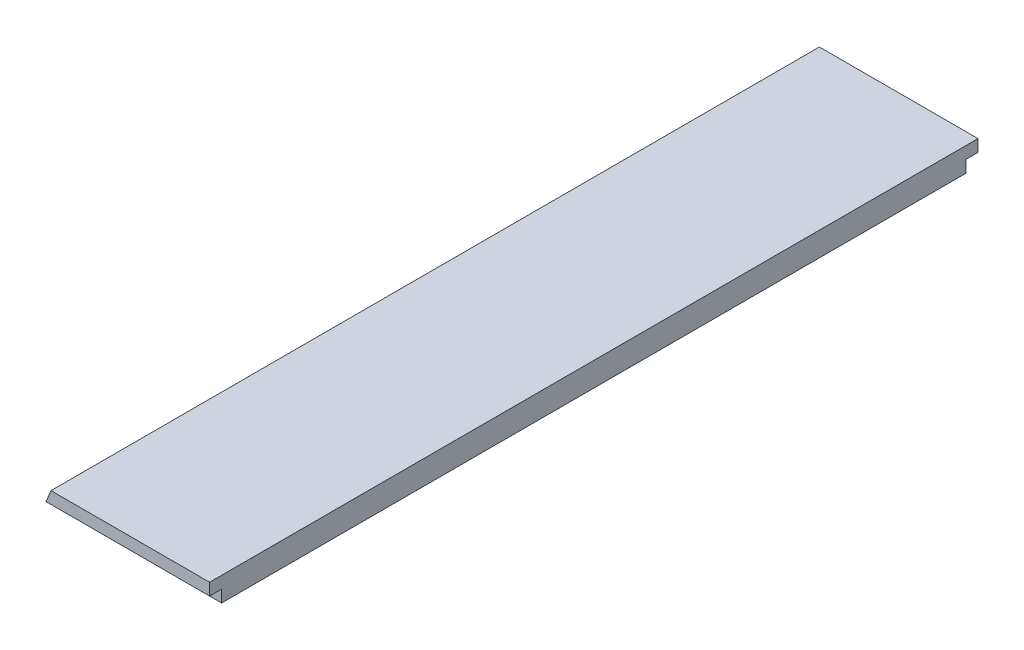
ISO-10303-21;
HEADER;
FILE_DESCRIPTION(('STEP AP214'),'2;1');
FILE_NAME('part.step','',(''),(''),'','','');
FILE_SCHEMA(('AUTOMOTIVE_DESIGN { 1 0 10303 214 1 1 1 1 }'));
ENDSEC;
DATA;
#1=APPLICATION_CONTEXT('core data for automotive mechanical design processes');
#2=APPLICATION_PROTOCOL_DEFINITION('international standard','automotive_design',2000,#1);
#3=PRODUCT_CONTEXT('',#1,'mechanical');
#4=PRODUCT('Part','Part','',(#3));
#5=PRODUCT_RELATED_PRODUCT_CATEGORY('part','',(#4));
#6=PRODUCT_DEFINITION_FORMATION('','',#4);
#7=PRODUCT_DEFINITION_CONTEXT('part definition',#1,'design');
#8=PRODUCT_DEFINITION('design','',#6,#7);
#9=PRODUCT_DEFINITION_SHAPE('','',#8);
#10=(LENGTH_UNIT() NAMED_UNIT(*) SI_UNIT(.MILLI.,.METRE.));
#11=(NAMED_UNIT(*) PLANE_ANGLE_UNIT() SI_UNIT($,.RADIAN.));
#12=(NAMED_UNIT(*) SI_UNIT($,.STERADIAN.) SOLID_ANGLE_UNIT());
#13=UNCERTAINTY_MEASURE_WITH_UNIT(LENGTH_MEASURE(1.E-05),#10,'distance_accuracy_value','');
#14=(GEOMETRIC_REPRESENTATION_CONTEXT(3) GLOBAL_UNCERTAINTY_ASSIGNED_CONTEXT((#13)) GLOBAL_UNIT_ASSIGNED_CONTEXT((#10,
#11,#12)) REPRESENTATION_CONTEXT('',''));
#15=CARTESIAN_POINT('',(0.,0.,0.));
#16=DIRECTION('',(0.,0.,1.));
#17=DIRECTION('',(1.,0.,0.));
#18=AXIS2_PLACEMENT_3D('',#15,#16,#17);
#19=CARTESIAN_POINT('',(0.,0.,406.4));
#20=DIRECTION('',(0.,0.,1.));
#21=DIRECTION('',(1.,0.,0.));
#22=AXIS2_PLACEMENT_3D('',#19,#20,#21);
#23=PLANE('',#22);
#24=DIRECTION('',(-0.382683432365094,-0.923879532511285,0.));
#25=VECTOR('',#24,1.);
#26=CARTESIAN_POINT('',(0.,0.,406.4));
#27=LINE('',#26,#25);
#28=CARTESIAN_POINT('',(5.26051224213836,12.7,406.4));
#29=VERTEX_POINT('',#28);
#30=CARTESIAN_POINT('',(2.63025612106918,6.35,406.4));
#31=VERTEX_POINT('',#30);
#32=EDGE_CURVE('E128',#29,#31,#27,.T.);
#33=ORIENTED_EDGE('',*,*,#32,.T.);
#34=DIRECTION('',(-1.,0.,0.));
#35=VECTOR('',#34,1.);
#36=CARTESIAN_POINT('',(0.,6.35,406.4));
#37=LINE('',#36,#35);
#38=CARTESIAN_POINT('',(89.154,6.35,406.4));
#39=VERTEX_POINT('',#38);
#40=EDGE_CURVE('E163',#39,#31,#37,.T.);
#41=ORIENTED_EDGE('',*,*,#40,.F.);
#42=DIRECTION('',(0.,1.,0.));
#43=VECTOR('',#42,1.);
#44=CARTESIAN_POINT('',(89.154,12.7,406.4));
#45=LINE('',#44,#43);
#46=CARTESIAN_POINT('',(89.154,12.7,406.4));
#47=VERTEX_POINT('',#46);
#48=EDGE_CURVE('E132',#39,#47,#45,.T.);
#49=ORIENTED_EDGE('',*,*,#48,.T.);
#50=DIRECTION('',(-1.,0.,0.));
#51=VECTOR('',#50,1.);
#52=CARTESIAN_POINT('',(5.26051224213836,12.7,406.4));
#53=LINE('',#52,#51);
#54=EDGE_CURVE('E168',#47,#29,#53,.T.);
#55=ORIENTED_EDGE('',*,*,#54,.T.);
#56=EDGE_LOOP('',(#33,#41,#49,#55));
#57=FACE_BOUND('',#56,.T.);
#58=ADVANCED_FACE('F34',(#57),#23,.T.);
#59=CARTESIAN_POINT('',(0.,0.,0.));
#60=DIRECTION('',(0.,0.,1.));
#61=DIRECTION('',(1.,0.,0.));
#62=AXIS2_PLACEMENT_3D('',#59,#60,#61);
#63=PLANE('',#62);
#64=DIRECTION('',(1.,0.,0.));
#65=VECTOR('',#64,1.);
#66=CARTESIAN_POINT('',(0.,6.35,0.));
#67=LINE('',#66,#65);
#68=CARTESIAN_POINT('',(2.63025612106918,6.35,0.));
#69=VERTEX_POINT('',#68);
#70=CARTESIAN_POINT('',(89.154,6.35,0.));
#71=VERTEX_POINT('',#70);
#72=EDGE_CURVE('E97',#69,#71,#67,.T.);
#73=ORIENTED_EDGE('',*,*,#72,.F.);
#74=DIRECTION('',(-0.382683432365094,-0.923879532511285,0.));
#75=VECTOR('',#74,1.);
#76=CARTESIAN_POINT('',(0.,0.,0.));
#77=LINE('',#76,#75);
#78=CARTESIAN_POINT('',(5.26051224213836,12.7,0.));
#79=VERTEX_POINT('',#78);
#80=EDGE_CURVE('E124',#79,#69,#77,.T.);
#81=ORIENTED_EDGE('',*,*,#80,.F.);
#82=DIRECTION('',(-1.,0.,0.));
#83=VECTOR('',#82,1.);
#84=CARTESIAN_POINT('',(5.26051224213836,12.7,0.));
#85=LINE('',#84,#83);
#86=CARTESIAN_POINT('',(89.154,12.7,0.));
#87=VERTEX_POINT('',#86);
#88=EDGE_CURVE('E121',#87,#79,#85,.T.);
#89=ORIENTED_EDGE('',*,*,#88,.F.);
#90=DIRECTION('',(0.,1.,0.));
#91=VECTOR('',#90,1.);
#92=CARTESIAN_POINT('',(89.154,12.7,0.));
#93=LINE('',#92,#91);
#94=EDGE_CURVE('E113',#71,#87,#93,.T.);
#95=ORIENTED_EDGE('',*,*,#94,.F.);
#96=EDGE_LOOP('',(#73,#81,#89,#95));
#97=FACE_BOUND('',#96,.T.);
#98=ADVANCED_FACE('F120',(#97),#63,.F.);
#99=CARTESIAN_POINT('',(89.154,0.,406.4));
#100=DIRECTION('',(0.,1.,0.));
#101=DIRECTION('',(-1.,0.,0.));
#102=AXIS2_PLACEMENT_3D('',#99,#100,#101);
#103=PLANE('',#102);
#104=DIRECTION('',(0.,0.,-1.));
#105=VECTOR('',#104,1.);
#106=CARTESIAN_POINT('',(0.,0.,406.4));
#107=LINE('',#106,#105);
#108=CARTESIAN_POINT('',(0.,0.,400.05));
#109=VERTEX_POINT('',#108);
#110=CARTESIAN_POINT('',(0.,0.,6.35));
#111=VERTEX_POINT('',#110);
#112=EDGE_CURVE('E133',#109,#111,#107,.T.);
#113=ORIENTED_EDGE('',*,*,#112,.T.);
#114=DIRECTION('',(-1.,0.,0.));
#115=VECTOR('',#114,1.);
#116=CARTESIAN_POINT('',(0.,0.,6.35));
#117=LINE('',#116,#115);
#118=CARTESIAN_POINT('',(89.154,0.,6.35));
#119=VERTEX_POINT('',#118);
#120=EDGE_CURVE('E117',#119,#111,#117,.T.);
#121=ORIENTED_EDGE('',*,*,#120,.F.);
#122=DIRECTION('',(0.,0.,-1.));
#123=VECTOR('',#122,1.);
#124=CARTESIAN_POINT('',(89.154,0.,406.4));
#125=LINE('',#124,#123);
#126=CARTESIAN_POINT('',(89.154,0.,400.05));
#127=VERTEX_POINT('',#126);
#128=EDGE_CURVE('E106',#127,#119,#125,.T.);
#129=ORIENTED_EDGE('',*,*,#128,.F.);
#130=DIRECTION('',(1.,0.,0.));
#131=VECTOR('',#130,1.);
#132=CARTESIAN_POINT('',(0.,0.,400.05));
#133=LINE('',#132,#131);
#134=EDGE_CURVE('E153',#109,#127,#133,.T.);
#135=ORIENTED_EDGE('',*,*,#134,.F.);
#136=EDGE_LOOP('',(#113,#121,#129,#135));
#137=FACE_BOUND('',#136,.T.);
#138=ADVANCED_FACE('F36',(#137),#103,.F.);
#139=CARTESIAN_POINT('',(89.154,12.7,406.4));
#140=DIRECTION('',(-1.,0.,0.));
#141=DIRECTION('',(0.,0.,1.));
#142=AXIS2_PLACEMENT_3D('',#139,#140,#141);
#143=PLANE('',#142);
#144=ORIENTED_EDGE('',*,*,#128,.T.);
#145=DIRECTION('',(0.,-1.,0.));
#146=VECTOR('',#145,1.);
#147=CARTESIAN_POINT('',(89.154,6.35,6.35));
#148=LINE('',#147,#146);
#149=CARTESIAN_POINT('',(89.154,6.35,6.35));
#150=VERTEX_POINT('',#149);
#151=EDGE_CURVE('E115',#150,#119,#148,.T.);
#152=ORIENTED_EDGE('',*,*,#151,.F.);
#153=DIRECTION('',(0.,0.,1.));
#154=VECTOR('',#153,1.);
#155=CARTESIAN_POINT('',(89.154,6.35,6.35));
#156=LINE('',#155,#154);
#157=EDGE_CURVE('E100',#71,#150,#156,.T.);
#158=ORIENTED_EDGE('',*,*,#157,.F.);
#159=ORIENTED_EDGE('',*,*,#94,.T.);
#160=DIRECTION('',(0.,0.,-1.));
#161=VECTOR('',#160,1.);
#162=CARTESIAN_POINT('',(89.154,12.7,406.4));
#163=LINE('',#162,#161);
#164=EDGE_CURVE('E139',#47,#87,#163,.T.);
#165=ORIENTED_EDGE('',*,*,#164,.F.);
#166=ORIENTED_EDGE('',*,*,#48,.F.);
#167=DIRECTION('',(0.,0.,1.));
#168=VECTOR('',#167,1.);
#169=CARTESIAN_POINT('',(89.154,6.35,406.4));
#170=LINE('',#169,#168);
#171=CARTESIAN_POINT('',(89.154,6.35,400.05));
#172=VERTEX_POINT('',#171);
#173=EDGE_CURVE('E49',#172,#39,#170,.T.);
#174=ORIENTED_EDGE('',*,*,#173,.F.);
#175=DIRECTION('',(0.,-1.,0.));
#176=VECTOR('',#175,1.);
#177=CARTESIAN_POINT('',(89.154,6.35,400.05));
#178=LINE('',#177,#176);
#179=EDGE_CURVE('E165',#172,#127,#178,.T.);
#180=ORIENTED_EDGE('',*,*,#179,.T.);
#181=EDGE_LOOP('',(#144,#152,#158,#159,#165,#166,#174,#180));
#182=FACE_BOUND('',#181,.T.);
#183=ADVANCED_FACE('F111',(#182),#143,.F.);
#184=CARTESIAN_POINT('',(5.26051224213836,12.7,406.4));
#185=DIRECTION('',(0.,-1.,0.));
#186=DIRECTION('',(1.,0.,0.));
#187=AXIS2_PLACEMENT_3D('',#184,#185,#186);
#188=PLANE('',#187);
#189=ORIENTED_EDGE('',*,*,#88,.T.);
#190=DIRECTION('',(0.,0.,-1.));
#191=VECTOR('',#190,1.);
#192=CARTESIAN_POINT('',(5.26051224213836,12.7,406.4));
#193=LINE('',#192,#191);
#194=EDGE_CURVE('E136',#29,#79,#193,.T.);
#195=ORIENTED_EDGE('',*,*,#194,.F.);
#196=ORIENTED_EDGE('',*,*,#54,.F.);
#197=ORIENTED_EDGE('',*,*,#164,.T.);
#198=EDGE_LOOP('',(#189,#195,#196,#197));
#199=FACE_BOUND('',#198,.T.);
#200=ADVANCED_FACE('F174',(#199),#188,.F.);
#201=CARTESIAN_POINT('',(0.,0.,406.4));
#202=DIRECTION('',(0.923879532511285,-0.382683432365094,0.));
#203=DIRECTION('',(0.382683432365094,0.923879532511285,0.));
#204=AXIS2_PLACEMENT_3D('',#201,#202,#203);
#205=PLANE('',#204);
#206=DIRECTION('',(0.,0.,-1.));
#207=VECTOR('',#206,1.);
#208=CARTESIAN_POINT('',(2.63025612106918,6.35,406.4));
#209=LINE('',#208,#207);
#210=CARTESIAN_POINT('',(2.63025612106918,6.35,6.35));
#211=VERTEX_POINT('',#210);
#212=EDGE_CURVE('E57',#211,#69,#209,.T.);
#213=ORIENTED_EDGE('',*,*,#212,.F.);
#214=DIRECTION('',(-0.382683432365094,-0.923879532511285,0.));
#215=VECTOR('',#214,1.);
#216=CARTESIAN_POINT('',(0.,0.,6.35000000000002));
#217=LINE('',#216,#215);
#218=EDGE_CURVE('E11',#211,#111,#217,.T.);
#219=ORIENTED_EDGE('',*,*,#218,.T.);
#220=ORIENTED_EDGE('',*,*,#112,.F.);
#221=DIRECTION('',(0.382683432365094,0.923879532511285,0.));
#222=VECTOR('',#221,1.);
#223=CARTESIAN_POINT('',(0.,0.,400.05));
#224=LINE('',#223,#222);
#225=CARTESIAN_POINT('',(2.63025612106918,6.35,400.05));
#226=VERTEX_POINT('',#225);
#227=EDGE_CURVE('E42',#109,#226,#224,.T.);
#228=ORIENTED_EDGE('',*,*,#227,.T.);
#229=DIRECTION('',(0.,0.,-1.));
#230=VECTOR('',#229,1.);
#231=CARTESIAN_POINT('',(2.63025612106918,6.35,406.4));
#232=LINE('',#231,#230);
#233=EDGE_CURVE('E122',#31,#226,#232,.T.);
#234=ORIENTED_EDGE('',*,*,#233,.F.);
#235=ORIENTED_EDGE('',*,*,#32,.F.);
#236=ORIENTED_EDGE('',*,*,#194,.T.);
#237=ORIENTED_EDGE('',*,*,#80,.T.);
#238=EDGE_LOOP('',(#213,#219,#220,#228,#234,#235,#236,#237));
#239=FACE_BOUND('',#238,.T.);
#240=ADVANCED_FACE('F145',(#239),#205,.F.);
#241=CARTESIAN_POINT('',(0.,6.35,6.35));
#242=DIRECTION('',(0.,0.,1.));
#243=DIRECTION('',(1.,0.,0.));
#244=AXIS2_PLACEMENT_3D('',#241,#242,#243);
#245=PLANE('',#244);
#246=DIRECTION('',(-1.,0.,0.));
#247=VECTOR('',#246,1.);
#248=CARTESIAN_POINT('',(0.,6.35,6.35));
#249=LINE('',#248,#247);
#250=EDGE_CURVE('E116',#150,#211,#249,.T.);
#251=ORIENTED_EDGE('',*,*,#250,.F.);
#252=ORIENTED_EDGE('',*,*,#151,.T.);
#253=ORIENTED_EDGE('',*,*,#120,.T.);
#254=ORIENTED_EDGE('',*,*,#218,.F.);
#255=EDGE_LOOP('',(#251,#252,#253,#254));
#256=FACE_BOUND('',#255,.T.);
#257=ADVANCED_FACE('F179',(#256),#245,.F.);
#258=CARTESIAN_POINT('',(0.,6.35,0.));
#259=DIRECTION('',(0.,-1.,0.));
#260=DIRECTION('',(1.,0.,0.));
#261=AXIS2_PLACEMENT_3D('',#258,#259,#260);
#262=PLANE('',#261);
#263=ORIENTED_EDGE('',*,*,#212,.T.);
#264=ORIENTED_EDGE('',*,*,#72,.T.);
#265=ORIENTED_EDGE('',*,*,#157,.T.);
#266=ORIENTED_EDGE('',*,*,#250,.T.);
#267=EDGE_LOOP('',(#263,#264,#265,#266));
#268=FACE_BOUND('',#267,.T.);
#269=ADVANCED_FACE('F99',(#268),#262,.T.);
#270=CARTESIAN_POINT('',(0.,6.35,400.05));
#271=DIRECTION('',(0.,0.,-1.));
#272=DIRECTION('',(-1.,0.,0.));
#273=AXIS2_PLACEMENT_3D('',#270,#271,#272);
#274=PLANE('',#273);
#275=ORIENTED_EDGE('',*,*,#134,.T.);
#276=ORIENTED_EDGE('',*,*,#179,.F.);
#277=DIRECTION('',(1.,0.,0.));
#278=VECTOR('',#277,1.);
#279=CARTESIAN_POINT('',(0.,6.35,400.05));
#280=LINE('',#279,#278);
#281=EDGE_CURVE('E155',#226,#172,#280,.T.);
#282=ORIENTED_EDGE('',*,*,#281,.F.);
#283=ORIENTED_EDGE('',*,*,#227,.F.);
#284=EDGE_LOOP('',(#275,#276,#282,#283));
#285=FACE_BOUND('',#284,.T.);
#286=ADVANCED_FACE('F151',(#285),#274,.F.);
#287=CARTESIAN_POINT('',(0.,6.35,0.));
#288=DIRECTION('',(0.,-1.,0.));
#289=DIRECTION('',(1.,0.,0.));
#290=AXIS2_PLACEMENT_3D('',#287,#288,#289);
#291=PLANE('',#290);
#292=ORIENTED_EDGE('',*,*,#233,.T.);
#293=ORIENTED_EDGE('',*,*,#281,.T.);
#294=ORIENTED_EDGE('',*,*,#173,.T.);
#295=ORIENTED_EDGE('',*,*,#40,.T.);
#296=EDGE_LOOP('',(#292,#293,#294,#295));
#297=FACE_BOUND('',#296,.T.);
#298=ADVANCED_FACE('F237',(#297),#291,.T.);
#299=CLOSED_SHELL('',(#58,#98,#138,#183,#200,#240,#257,#269,#286,#298));
#300=MANIFOLD_SOLID_BREP('B2',#299);
#301=ADVANCED_BREP_SHAPE_REPRESENTATION('',(#18,#300),#14);
#302=SHAPE_DEFINITION_REPRESENTATION(#9,#301);
ENDSEC;
END-ISO-10303-21;
